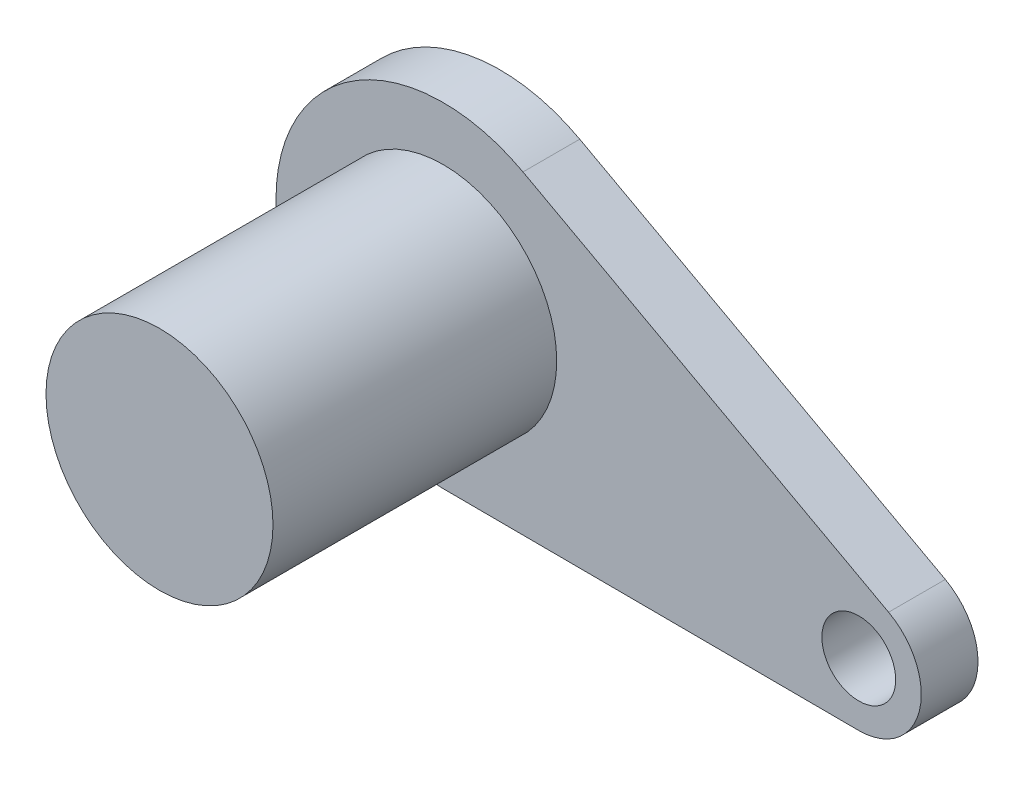
ISO-10303-21;
HEADER;
FILE_DESCRIPTION(('STEP AP214'),'2;1');
FILE_NAME('part.step','',(''),(''),'','','');
FILE_SCHEMA(('AUTOMOTIVE_DESIGN { 1 0 10303 214 1 1 1 1 }'));
ENDSEC;
DATA;
#1=APPLICATION_CONTEXT('core data for automotive mechanical design processes');
#2=APPLICATION_PROTOCOL_DEFINITION('international standard','automotive_design',2000,#1);
#3=PRODUCT_CONTEXT('',#1,'mechanical');
#4=PRODUCT('Part','Part','',(#3));
#5=PRODUCT_RELATED_PRODUCT_CATEGORY('part','',(#4));
#6=PRODUCT_DEFINITION_FORMATION('','',#4);
#7=PRODUCT_DEFINITION_CONTEXT('part definition',#1,'design');
#8=PRODUCT_DEFINITION('design','',#6,#7);
#9=PRODUCT_DEFINITION_SHAPE('','',#8);
#10=(LENGTH_UNIT() NAMED_UNIT(*) SI_UNIT(.MILLI.,.METRE.));
#11=(NAMED_UNIT(*) PLANE_ANGLE_UNIT() SI_UNIT($,.RADIAN.));
#12=(NAMED_UNIT(*) SI_UNIT($,.STERADIAN.) SOLID_ANGLE_UNIT());
#13=UNCERTAINTY_MEASURE_WITH_UNIT(LENGTH_MEASURE(1.E-05),#10,'distance_accuracy_value','');
#14=(GEOMETRIC_REPRESENTATION_CONTEXT(3) GLOBAL_UNCERTAINTY_ASSIGNED_CONTEXT((#13)) GLOBAL_UNIT_ASSIGNED_CONTEXT((#10,
#11,#12)) REPRESENTATION_CONTEXT('',''));
#15=CARTESIAN_POINT('',(0.,0.,0.));
#16=DIRECTION('',(0.,0.,1.));
#17=DIRECTION('',(1.,0.,0.));
#18=AXIS2_PLACEMENT_3D('',#15,#16,#17);
#19=CARTESIAN_POINT('',(30.458296942447,35.7329181393817,-5.));
#20=DIRECTION('',(0.,0.,1.));
#21=DIRECTION('',(1.,0.,0.));
#22=AXIS2_PLACEMENT_3D('',#19,#20,#21);
#23=CYLINDRICAL_SURFACE('',#22,2.);
#24=CARTESIAN_POINT('',(30.458296942447,35.7329181393817,-5.));
#25=DIRECTION('',(0.,0.,1.));
#26=DIRECTION('',(1.,0.,0.));
#27=AXIS2_PLACEMENT_3D('',#24,#25,#26);
#28=CIRCLE('',#27,2.);
#29=CARTESIAN_POINT('',(32.458296942447,35.7329181393817,-5.));
#30=VERTEX_POINT('',#29);
#31=EDGE_CURVE('E45',#30,#30,#28,.T.);
#32=ORIENTED_EDGE('',*,*,#31,.T.);
#33=EDGE_LOOP('',(#32));
#34=FACE_BOUND('',#33,.T.);
#35=CARTESIAN_POINT('',(30.458296942447,35.7329181393817,0.));
#36=DIRECTION('',(0.,0.,1.));
#37=DIRECTION('',(1.,0.,0.));
#38=AXIS2_PLACEMENT_3D('',#35,#36,#37);
#39=CIRCLE('',#38,2.);
#40=CARTESIAN_POINT('',(32.458296942447,35.7329181393817,0.));
#41=VERTEX_POINT('',#40);
#42=EDGE_CURVE('E11',#41,#41,#39,.T.);
#43=ORIENTED_EDGE('',*,*,#42,.F.);
#44=EDGE_LOOP('',(#43));
#45=FACE_BOUND('',#44,.T.);
#46=ADVANCED_FACE('F36',(#34,#45),#23,.T.);
#47=CARTESIAN_POINT('',(30.458296942447,35.7329181393817,0.));
#48=DIRECTION('',(0.,0.,1.));
#49=DIRECTION('',(1.,0.,0.));
#50=AXIS2_PLACEMENT_3D('',#47,#48,#49);
#51=PLANE('',#50);
#52=ORIENTED_EDGE('',*,*,#42,.T.);
#53=EDGE_LOOP('',(#52));
#54=FACE_BOUND('',#53,.T.);
#55=ADVANCED_FACE('F138',(#54),#51,.T.);
#56=CARTESIAN_POINT('',(37.7817734978803,33.8571997636586,-6.));
#57=DIRECTION('',(0.,0.,1.));
#58=DIRECTION('',(1.,0.,0.));
#59=AXIS2_PLACEMENT_3D('',#56,#57,#58);
#60=CYLINDRICAL_SURFACE('',#59,1.10103964826934);
#61=CARTESIAN_POINT('',(37.7817734978803,33.8571997636586,-5.));
#62=DIRECTION('',(0.,0.,-1.));
#63=DIRECTION('',(-1.,0.,0.));
#64=AXIS2_PLACEMENT_3D('',#61,#62,#63);
#65=CIRCLE('',#64,1.10103964826934);
#66=CARTESIAN_POINT('',(38.3071015703301,34.824835399297,-5.));
#67=VERTEX_POINT('',#66);
#68=CARTESIAN_POINT('',(37.7817734978803,32.7561601153893,-5.));
#69=VERTEX_POINT('',#68);
#70=EDGE_CURVE('E106',#67,#69,#65,.T.);
#71=ORIENTED_EDGE('',*,*,#70,.T.);
#72=DIRECTION('',(0.,0.,1.));
#73=VECTOR('',#72,1.);
#74=CARTESIAN_POINT('',(37.7817734978803,32.7561601153893,-6.));
#75=LINE('',#74,#73);
#76=CARTESIAN_POINT('',(37.7817734978803,32.7561601153893,-6.));
#77=VERTEX_POINT('',#76);
#78=EDGE_CURVE('E93',#77,#69,#75,.T.);
#79=ORIENTED_EDGE('',*,*,#78,.F.);
#80=CARTESIAN_POINT('',(37.7817734978803,33.8571997636586,-6.));
#81=DIRECTION('',(0.,0.,-1.));
#82=DIRECTION('',(-1.,0.,0.));
#83=AXIS2_PLACEMENT_3D('',#80,#81,#82);
#84=CIRCLE('',#83,1.10103964826934);
#85=CARTESIAN_POINT('',(38.3071015703301,34.824835399297,-6.));
#86=VERTEX_POINT('',#85);
#87=EDGE_CURVE('E79',#86,#77,#84,.T.);
#88=ORIENTED_EDGE('',*,*,#87,.F.);
#89=DIRECTION('',(0.,0.,1.));
#90=VECTOR('',#89,1.);
#91=CARTESIAN_POINT('',(38.3071015703301,34.824835399297,-6.));
#92=LINE('',#91,#90);
#93=EDGE_CURVE('E53',#86,#67,#92,.T.);
#94=ORIENTED_EDGE('',*,*,#93,.T.);
#95=EDGE_LOOP('',(#71,#79,#88,#94));
#96=FACE_BOUND('',#95,.T.);
#97=ADVANCED_FACE('F142',(#96),#60,.T.);
#98=CARTESIAN_POINT('',(0.13467541937042,32.9102198193243,-6.));
#99=DIRECTION('',(-0.00409217235485555,-0.999991627027656,0.));
#100=DIRECTION('',(0.999991627027656,-0.00409217235485556,0.));
#101=AXIS2_PLACEMENT_3D('',#98,#99,#100);
#102=PLANE('',#101);
#103=DIRECTION('',(0.999991627027656,-0.00409217235485556,0.));
#104=VECTOR('',#103,1.);
#105=CARTESIAN_POINT('',(0.13467541937042,32.9102198193243,-5.));
#106=LINE('',#105,#104);
#107=CARTESIAN_POINT('',(30.4462382755686,32.7861786411784,-5.));
#108=VERTEX_POINT('',#107);
#109=EDGE_CURVE('E90',#108,#69,#106,.T.);
#110=ORIENTED_EDGE('',*,*,#109,.F.);
#111=DIRECTION('',(0.,0.,1.));
#112=VECTOR('',#111,1.);
#113=CARTESIAN_POINT('',(30.4462382755686,32.7861786411784,-6.));
#114=LINE('',#113,#112);
#115=CARTESIAN_POINT('',(30.4462382755686,32.7861786411784,-6.));
#116=VERTEX_POINT('',#115);
#117=EDGE_CURVE('E85',#116,#108,#114,.T.);
#118=ORIENTED_EDGE('',*,*,#117,.F.);
#119=DIRECTION('',(0.999991627027656,-0.00409217235485556,0.));
#120=VECTOR('',#119,1.);
#121=CARTESIAN_POINT('',(0.13467541937042,32.9102198193243,-6.));
#122=LINE('',#121,#120);
#123=EDGE_CURVE('E88',#116,#77,#122,.T.);
#124=ORIENTED_EDGE('',*,*,#123,.T.);
#125=ORIENTED_EDGE('',*,*,#78,.T.);
#126=EDGE_LOOP('',(#110,#118,#124,#125));
#127=FACE_BOUND('',#126,.T.);
#128=ADVANCED_FACE('F87',(#127),#102,.T.);
#129=CARTESIAN_POINT('',(30.458296942447,35.7329181393817,-6.));
#130=DIRECTION('',(0.,0.,1.));
#131=DIRECTION('',(1.,0.,0.));
#132=AXIS2_PLACEMENT_3D('',#129,#130,#131);
#133=CYLINDRICAL_SURFACE('',#132,2.94676417137821);
#134=CARTESIAN_POINT('',(30.458296942447,35.7329181393817,-5.));
#135=DIRECTION('',(0.,0.,-1.));
#136=DIRECTION('',(-1.,0.,0.));
#137=AXIS2_PLACEMENT_3D('',#134,#135,#136);
#138=CIRCLE('',#137,2.94676417137821);
#139=CARTESIAN_POINT('',(31.8642571588184,38.322646880331,-5.));
#140=VERTEX_POINT('',#139);
#141=EDGE_CURVE('E109',#108,#140,#138,.T.);
#142=ORIENTED_EDGE('',*,*,#141,.T.);
#143=DIRECTION('',(0.,0.,1.));
#144=VECTOR('',#143,1.);
#145=CARTESIAN_POINT('',(31.8642571588184,38.322646880331,-6.));
#146=LINE('',#145,#144);
#147=CARTESIAN_POINT('',(31.8642571588184,38.322646880331,-6.));
#148=VERTEX_POINT('',#147);
#149=EDGE_CURVE('E68',#148,#140,#146,.T.);
#150=ORIENTED_EDGE('',*,*,#149,.F.);
#151=CARTESIAN_POINT('',(30.458296942447,35.7329181393817,-6.));
#152=DIRECTION('',(0.,0.,-1.));
#153=DIRECTION('',(-1.,0.,0.));
#154=AXIS2_PLACEMENT_3D('',#151,#152,#153);
#155=CIRCLE('',#154,2.94676417137821);
#156=EDGE_CURVE('E95',#116,#148,#155,.T.);
#157=ORIENTED_EDGE('',*,*,#156,.F.);
#158=ORIENTED_EDGE('',*,*,#117,.T.);
#159=EDGE_LOOP('',(#142,#150,#157,#158));
#160=FACE_BOUND('',#159,.T.);
#161=ADVANCED_FACE('F96',(#160),#133,.T.);
#162=CARTESIAN_POINT('',(23.3228099906484,42.9597869478592,-6.));
#163=DIRECTION('',(0.477120032212779,0.878838139170847,0.));
#164=DIRECTION('',(-0.878838139170847,0.477120032212779,0.));
#165=AXIS2_PLACEMENT_3D('',#162,#163,#164);
#166=PLANE('',#165);
#167=DIRECTION('',(-0.878838139170847,0.477120032212779,0.));
#168=VECTOR('',#167,1.);
#169=CARTESIAN_POINT('',(23.3228099906484,42.9597869478592,-5.));
#170=LINE('',#169,#168);
#171=EDGE_CURVE('E101',#67,#140,#170,.T.);
#172=ORIENTED_EDGE('',*,*,#171,.F.);
#173=ORIENTED_EDGE('',*,*,#93,.F.);
#174=DIRECTION('',(-0.878838139170847,0.477120032212779,0.));
#175=VECTOR('',#174,1.);
#176=CARTESIAN_POINT('',(23.3228099906484,42.9597869478592,-6.));
#177=LINE('',#176,#175);
#178=EDGE_CURVE('E97',#86,#148,#177,.T.);
#179=ORIENTED_EDGE('',*,*,#178,.T.);
#180=ORIENTED_EDGE('',*,*,#149,.T.);
#181=EDGE_LOOP('',(#172,#173,#179,#180));
#182=FACE_BOUND('',#181,.T.);
#183=ADVANCED_FACE('F127',(#182),#166,.T.);
#184=CARTESIAN_POINT('',(0.,0.,-6.));
#185=DIRECTION('',(0.,0.,-1.));
#186=DIRECTION('',(-1.,0.,0.));
#187=AXIS2_PLACEMENT_3D('',#184,#185,#186);
#188=PLANE('',#187);
#189=CARTESIAN_POINT('',(37.7817734978803,33.8571997636586,-6.));
#190=DIRECTION('',(0.,0.,1.));
#191=DIRECTION('',(1.,0.,0.));
#192=AXIS2_PLACEMENT_3D('',#189,#190,#191);
#193=CIRCLE('',#192,0.649999999999997);
#194=CARTESIAN_POINT('',(38.4317734978803,33.8571997636586,-6.));
#195=VERTEX_POINT('',#194);
#196=EDGE_CURVE('E194',#195,#195,#193,.T.);
#197=ORIENTED_EDGE('',*,*,#196,.T.);
#198=EDGE_LOOP('',(#197));
#199=FACE_BOUND('',#198,.T.);
#200=ORIENTED_EDGE('',*,*,#87,.T.);
#201=ORIENTED_EDGE('',*,*,#123,.F.);
#202=ORIENTED_EDGE('',*,*,#156,.T.);
#203=ORIENTED_EDGE('',*,*,#178,.F.);
#204=EDGE_LOOP('',(#200,#201,#202,#203));
#205=FACE_BOUND('',#204,.T.);
#206=ADVANCED_FACE('F99',(#199,#205),#188,.T.);
#207=CARTESIAN_POINT('',(0.,0.,-5.));
#208=DIRECTION('',(0.,0.,-1.));
#209=DIRECTION('',(-1.,0.,0.));
#210=AXIS2_PLACEMENT_3D('',#207,#208,#209);
#211=PLANE('',#210);
#212=CARTESIAN_POINT('',(37.7817734978803,33.8571997636586,-5.));
#213=DIRECTION('',(0.,0.,-1.));
#214=DIRECTION('',(-1.,0.,0.));
#215=AXIS2_PLACEMENT_3D('',#212,#213,#214);
#216=CIRCLE('',#215,0.649999999999997);
#217=CARTESIAN_POINT('',(37.1317734978803,33.8571997636586,-5.));
#218=VERTEX_POINT('',#217);
#219=EDGE_CURVE('E39',#218,#218,#216,.T.);
#220=ORIENTED_EDGE('',*,*,#219,.T.);
#221=EDGE_LOOP('',(#220));
#222=FACE_BOUND('',#221,.T.);
#223=ORIENTED_EDGE('',*,*,#31,.F.);
#224=EDGE_LOOP('',(#223));
#225=FACE_BOUND('',#224,.T.);
#226=ORIENTED_EDGE('',*,*,#70,.F.);
#227=ORIENTED_EDGE('',*,*,#171,.T.);
#228=ORIENTED_EDGE('',*,*,#141,.F.);
#229=ORIENTED_EDGE('',*,*,#109,.T.);
#230=EDGE_LOOP('',(#226,#227,#228,#229));
#231=FACE_BOUND('',#230,.T.);
#232=ADVANCED_FACE('F121',(#222,#225,#231),#211,.F.);
#233=CARTESIAN_POINT('',(37.7817734978803,33.8571997636586,-6.));
#234=DIRECTION('',(0.,0.,1.));
#235=DIRECTION('',(1.,0.,0.));
#236=AXIS2_PLACEMENT_3D('',#233,#234,#235);
#237=CYLINDRICAL_SURFACE('',#236,0.649999999999997);
#238=ORIENTED_EDGE('',*,*,#196,.F.);
#239=EDGE_LOOP('',(#238));
#240=FACE_BOUND('',#239,.T.);
#241=ORIENTED_EDGE('',*,*,#219,.F.);
#242=EDGE_LOOP('',(#241));
#243=FACE_BOUND('',#242,.T.);
#244=ADVANCED_FACE('F124',(#240,#243),#237,.F.);
#245=CLOSED_SHELL('',(#46,#55,#97,#128,#161,#183,#206,#232,#244));
#246=MANIFOLD_SOLID_BREP('B2',#245);
#247=ADVANCED_BREP_SHAPE_REPRESENTATION('',(#18,#246),#14);
#248=SHAPE_DEFINITION_REPRESENTATION(#9,#247);
ENDSEC;
END-ISO-10303-21;
